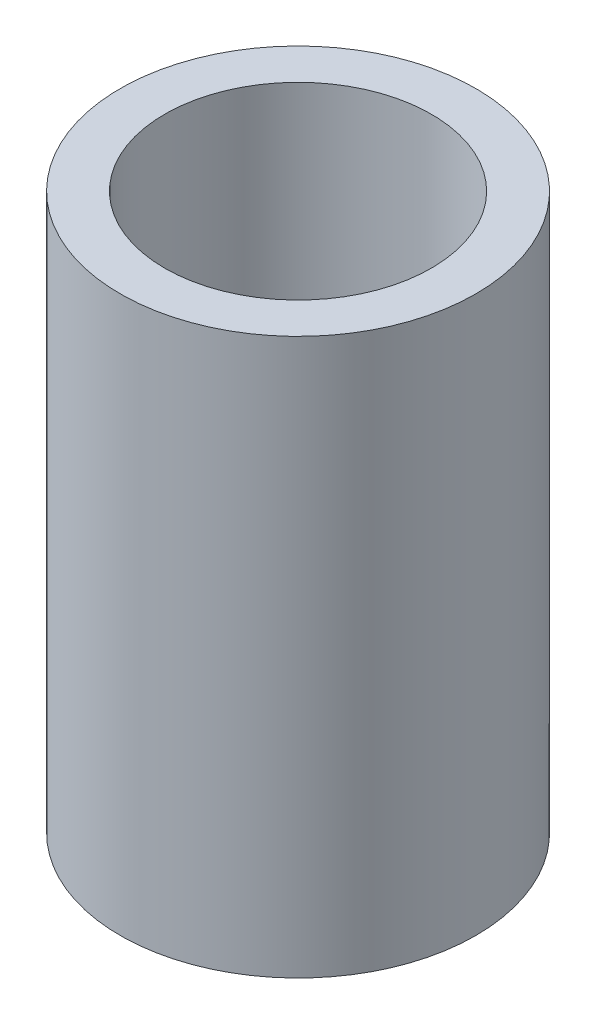
ISO-10303-21;
HEADER;
FILE_DESCRIPTION(('STEP AP214'),'2;1');
FILE_NAME('part.step','',(''),(''),'','','');
FILE_SCHEMA(('AUTOMOTIVE_DESIGN { 1 0 10303 214 1 1 1 1 }'));
ENDSEC;
DATA;
#1=APPLICATION_CONTEXT('core data for automotive mechanical design processes');
#2=APPLICATION_PROTOCOL_DEFINITION('international standard','automotive_design',2000,#1);
#3=PRODUCT_CONTEXT('',#1,'mechanical');
#4=PRODUCT('Part','Part','',(#3));
#5=PRODUCT_RELATED_PRODUCT_CATEGORY('part','',(#4));
#6=PRODUCT_DEFINITION_FORMATION('','',#4);
#7=PRODUCT_DEFINITION_CONTEXT('part definition',#1,'design');
#8=PRODUCT_DEFINITION('design','',#6,#7);
#9=PRODUCT_DEFINITION_SHAPE('','',#8);
#10=(LENGTH_UNIT() NAMED_UNIT(*) SI_UNIT(.MILLI.,.METRE.));
#11=(NAMED_UNIT(*) PLANE_ANGLE_UNIT() SI_UNIT($,.RADIAN.));
#12=(NAMED_UNIT(*) SI_UNIT($,.STERADIAN.) SOLID_ANGLE_UNIT());
#13=UNCERTAINTY_MEASURE_WITH_UNIT(LENGTH_MEASURE(1.E-05),#10,'distance_accuracy_value','');
#14=(GEOMETRIC_REPRESENTATION_CONTEXT(3) GLOBAL_UNCERTAINTY_ASSIGNED_CONTEXT((#13)) GLOBAL_UNIT_ASSIGNED_CONTEXT((#10,
#11,#12)) REPRESENTATION_CONTEXT('',''));
#15=CARTESIAN_POINT('',(0.,0.,0.));
#16=DIRECTION('',(0.,0.,1.));
#17=DIRECTION('',(1.,0.,0.));
#18=AXIS2_PLACEMENT_3D('',#15,#16,#17);
#19=CARTESIAN_POINT('',(0.,25.,0.));
#20=DIRECTION('',(0.,1.,0.));
#21=DIRECTION('',(0.,0.,1.));
#22=AXIS2_PLACEMENT_3D('',#19,#20,#21);
#23=PLANE('',#22);
#24=CARTESIAN_POINT('',(0.,25.,0.));
#25=DIRECTION('',(0.,1.,0.));
#26=DIRECTION('',(1.,0.,0.));
#27=AXIS2_PLACEMENT_3D('',#24,#25,#26);
#28=CIRCLE('',#27,8.);
#29=CARTESIAN_POINT('',(8.,25.,0.));
#30=VERTEX_POINT('',#29);
#31=EDGE_CURVE('E11',#30,#30,#28,.T.);
#32=ORIENTED_EDGE('',*,*,#31,.T.);
#33=EDGE_LOOP('',(#32));
#34=FACE_BOUND('',#33,.T.);
#35=CARTESIAN_POINT('',(0.,25.,0.));
#36=DIRECTION('',(0.,1.,0.));
#37=DIRECTION('',(0.,0.,1.));
#38=AXIS2_PLACEMENT_3D('',#35,#36,#37);
#39=CIRCLE('',#38,6.);
#40=CARTESIAN_POINT('',(0.,25.,6.));
#41=VERTEX_POINT('',#40);
#42=EDGE_CURVE('E47',#41,#41,#39,.T.);
#43=ORIENTED_EDGE('',*,*,#42,.F.);
#44=EDGE_LOOP('',(#43));
#45=FACE_BOUND('',#44,.T.);
#46=ADVANCED_FACE('F36',(#34,#45),#23,.T.);
#47=CARTESIAN_POINT('',(0.,0.,0.));
#48=DIRECTION('',(0.,1.,0.));
#49=DIRECTION('',(0.,0.,1.));
#50=AXIS2_PLACEMENT_3D('',#47,#48,#49);
#51=PLANE('',#50);
#52=CARTESIAN_POINT('',(0.,0.,0.));
#53=DIRECTION('',(0.,1.,0.));
#54=DIRECTION('',(1.,0.,0.));
#55=AXIS2_PLACEMENT_3D('',#52,#53,#54);
#56=CIRCLE('',#55,8.);
#57=CARTESIAN_POINT('',(8.,0.,0.));
#58=VERTEX_POINT('',#57);
#59=EDGE_CURVE('E40',#58,#58,#56,.T.);
#60=ORIENTED_EDGE('',*,*,#59,.F.);
#61=EDGE_LOOP('',(#60));
#62=FACE_BOUND('',#61,.T.);
#63=CARTESIAN_POINT('',(0.,0.,0.));
#64=DIRECTION('',(0.,1.,0.));
#65=DIRECTION('',(0.,0.,1.));
#66=AXIS2_PLACEMENT_3D('',#63,#64,#65);
#67=CIRCLE('',#66,6.);
#68=CARTESIAN_POINT('',(0.,0.,6.));
#69=VERTEX_POINT('',#68);
#70=EDGE_CURVE('E49',#69,#69,#67,.T.);
#71=ORIENTED_EDGE('',*,*,#70,.T.);
#72=EDGE_LOOP('',(#71));
#73=FACE_BOUND('',#72,.T.);
#74=ADVANCED_FACE('F59',(#62,#73),#51,.F.);
#75=CARTESIAN_POINT('',(0.,25.,0.));
#76=DIRECTION('',(0.,-1.,0.));
#77=DIRECTION('',(0.,0.,-1.));
#78=AXIS2_PLACEMENT_3D('',#75,#76,#77);
#79=CYLINDRICAL_SURFACE('',#78,8.);
#80=ORIENTED_EDGE('',*,*,#31,.F.);
#81=EDGE_LOOP('',(#80));
#82=FACE_BOUND('',#81,.T.);
#83=ORIENTED_EDGE('',*,*,#59,.T.);
#84=EDGE_LOOP('',(#83));
#85=FACE_BOUND('',#84,.T.);
#86=ADVANCED_FACE('F38',(#82,#85),#79,.T.);
#87=CARTESIAN_POINT('',(0.,25.,0.));
#88=DIRECTION('',(0.,-1.,0.));
#89=DIRECTION('',(0.,0.,-1.));
#90=AXIS2_PLACEMENT_3D('',#87,#88,#89);
#91=CYLINDRICAL_SURFACE('',#90,6.);
#92=ORIENTED_EDGE('',*,*,#42,.T.);
#93=EDGE_LOOP('',(#92));
#94=FACE_BOUND('',#93,.T.);
#95=ORIENTED_EDGE('',*,*,#70,.F.);
#96=EDGE_LOOP('',(#95));
#97=FACE_BOUND('',#96,.T.);
#98=ADVANCED_FACE('F55',(#94,#97),#91,.F.);
#99=CLOSED_SHELL('',(#46,#74,#86,#98));
#100=MANIFOLD_SOLID_BREP('B2',#99);
#101=ADVANCED_BREP_SHAPE_REPRESENTATION('',(#18,#100),#14);
#102=SHAPE_DEFINITION_REPRESENTATION(#9,#101);
ENDSEC;
END-ISO-10303-21;
